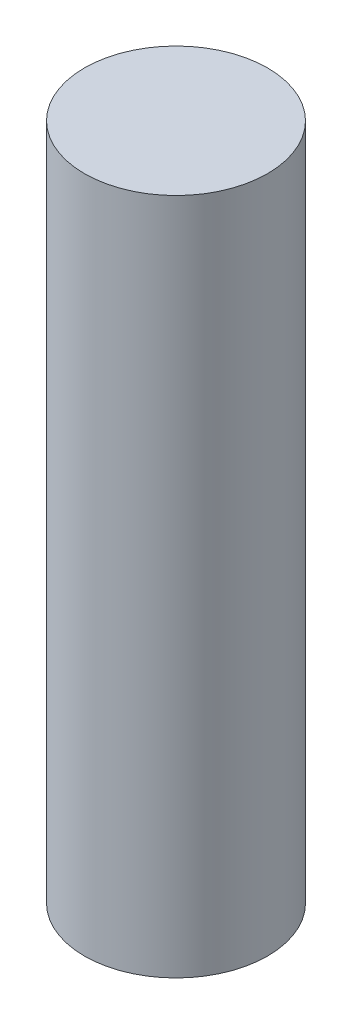
ISO-10303-21;
HEADER;
FILE_DESCRIPTION(('STEP AP214'),'2;1');
FILE_NAME('part.step','',(''),(''),'','','');
FILE_SCHEMA(('AUTOMOTIVE_DESIGN { 1 0 10303 214 1 1 1 1 }'));
ENDSEC;
DATA;
#1=APPLICATION_CONTEXT('core data for automotive mechanical design processes');
#2=APPLICATION_PROTOCOL_DEFINITION('international standard','automotive_design',2000,#1);
#3=PRODUCT_CONTEXT('',#1,'mechanical');
#4=PRODUCT('Part','Part','',(#3));
#5=PRODUCT_RELATED_PRODUCT_CATEGORY('part','',(#4));
#6=PRODUCT_DEFINITION_FORMATION('','',#4);
#7=PRODUCT_DEFINITION_CONTEXT('part definition',#1,'design');
#8=PRODUCT_DEFINITION('design','',#6,#7);
#9=PRODUCT_DEFINITION_SHAPE('','',#8);
#10=(LENGTH_UNIT() NAMED_UNIT(*) SI_UNIT(.MILLI.,.METRE.));
#11=(NAMED_UNIT(*) PLANE_ANGLE_UNIT() SI_UNIT($,.RADIAN.));
#12=(NAMED_UNIT(*) SI_UNIT($,.STERADIAN.) SOLID_ANGLE_UNIT());
#13=UNCERTAINTY_MEASURE_WITH_UNIT(LENGTH_MEASURE(1.E-05),#10,'distance_accuracy_value','');
#14=(GEOMETRIC_REPRESENTATION_CONTEXT(3) GLOBAL_UNCERTAINTY_ASSIGNED_CONTEXT((#13)) GLOBAL_UNIT_ASSIGNED_CONTEXT((#10,
#11,#12)) REPRESENTATION_CONTEXT('',''));
#15=CARTESIAN_POINT('',(0.,0.,0.));
#16=DIRECTION('',(0.,0.,1.));
#17=DIRECTION('',(1.,0.,0.));
#18=AXIS2_PLACEMENT_3D('',#15,#16,#17);
#19=CARTESIAN_POINT('',(0.,93.98,0.));
#20=DIRECTION('',(0.,-1.,0.));
#21=DIRECTION('',(0.,0.,-1.));
#22=AXIS2_PLACEMENT_3D('',#19,#20,#21);
#23=CYLINDRICAL_SURFACE('',#22,12.7);
#24=CARTESIAN_POINT('',(0.,93.98,0.));
#25=DIRECTION('',(0.,1.,0.));
#26=DIRECTION('',(0.,0.,1.));
#27=AXIS2_PLACEMENT_3D('',#24,#25,#26);
#28=CIRCLE('',#27,12.7);
#29=CARTESIAN_POINT('',(0.,93.98,-12.7));
#30=VERTEX_POINT('',#29);
#31=EDGE_CURVE('E10',#30,#30,#28,.T.);
#32=CARTESIAN_POINT('',(0.,0.,0.));
#33=DIRECTION('',(0.,1.,0.));
#34=DIRECTION('',(0.,0.,1.));
#35=AXIS2_PLACEMENT_3D('',#32,#33,#34);
#36=CIRCLE('',#35,12.7);
#37=CARTESIAN_POINT('',(0.,0.,-12.7));
#38=VERTEX_POINT('',#37);
#39=EDGE_CURVE('E38',#38,#38,#36,.T.);
#40=CARTESIAN_POINT('',(0.,93.98,-12.7));
#41=CARTESIAN_POINT('',(0.,93.0010416666667,-12.7));
#42=CARTESIAN_POINT('',(0.,92.0220833333333,-12.7));
#43=CARTESIAN_POINT('',(0.,90.0641666666666,-12.7));
#44=CARTESIAN_POINT('',(0.,89.0852083333333,-12.7));
#45=CARTESIAN_POINT('',(0.,87.1272916666666,-12.7));
#46=CARTESIAN_POINT('',(0.,86.1483333333333,-12.7));
#47=CARTESIAN_POINT('',(0.,84.1904166666666,-12.7));
#48=CARTESIAN_POINT('',(0.,83.2114583333333,-12.7));
#49=CARTESIAN_POINT('',(0.,81.2535416666666,-12.7));
#50=CARTESIAN_POINT('',(0.,80.2745833333333,-12.7));
#51=CARTESIAN_POINT('',(0.,78.3166666666666,-12.7));
#52=CARTESIAN_POINT('',(0.,77.3377083333333,-12.7));
#53=CARTESIAN_POINT('',(0.,75.3797916666666,-12.7));
#54=CARTESIAN_POINT('',(0.,74.4008333333333,-12.7));
#55=CARTESIAN_POINT('',(0.,72.4429166666666,-12.7));
#56=CARTESIAN_POINT('',(0.,71.4639583333333,-12.7));
#57=CARTESIAN_POINT('',(0.,69.5060416666666,-12.7));
#58=CARTESIAN_POINT('',(0.,68.5270833333333,-12.7));
#59=CARTESIAN_POINT('',(0.,66.5691666666666,-12.7));
#60=CARTESIAN_POINT('',(0.,65.5902083333333,-12.7));
#61=CARTESIAN_POINT('',(0.,63.6322916666666,-12.7));
#62=CARTESIAN_POINT('',(0.,62.6533333333333,-12.7));
#63=CARTESIAN_POINT('',(0.,60.6954166666666,-12.7));
#64=CARTESIAN_POINT('',(0.,59.7164583333333,-12.7));
#65=CARTESIAN_POINT('',(0.,57.7585416666666,-12.7));
#66=CARTESIAN_POINT('',(0.,56.7795833333333,-12.7));
#67=CARTESIAN_POINT('',(0.,54.8216666666666,-12.7));
#68=CARTESIAN_POINT('',(0.,53.8427083333333,-12.7));
#69=CARTESIAN_POINT('',(0.,51.8847916666666,-12.7));
#70=CARTESIAN_POINT('',(0.,50.9058333333333,-12.7));
#71=CARTESIAN_POINT('',(0.,48.9479166666666,-12.7));
#72=CARTESIAN_POINT('',(0.,47.9689583333333,-12.7));
#73=CARTESIAN_POINT('',(0.,46.0110416666666,-12.7));
#74=CARTESIAN_POINT('',(0.,45.0320833333333,-12.7));
#75=CARTESIAN_POINT('',(0.,43.0741666666666,-12.7));
#76=CARTESIAN_POINT('',(0.,42.0952083333333,-12.7));
#77=CARTESIAN_POINT('',(0.,40.1372916666666,-12.7));
#78=CARTESIAN_POINT('',(0.,39.1583333333333,-12.7));
#79=CARTESIAN_POINT('',(0.,37.2004166666666,-12.7));
#80=CARTESIAN_POINT('',(0.,36.2214583333333,-12.7));
#81=CARTESIAN_POINT('',(0.,34.2635416666666,-12.7));
#82=CARTESIAN_POINT('',(0.,33.2845833333333,-12.7));
#83=CARTESIAN_POINT('',(0.,31.3266666666667,-12.7));
#84=CARTESIAN_POINT('',(0.,30.3477083333333,-12.7));
#85=CARTESIAN_POINT('',(0.,28.3897916666667,-12.7));
#86=CARTESIAN_POINT('',(0.,27.4108333333333,-12.7));
#87=CARTESIAN_POINT('',(0.,25.4529166666667,-12.7));
#88=CARTESIAN_POINT('',(0.,24.4739583333333,-12.7));
#89=CARTESIAN_POINT('',(0.,22.5160416666667,-12.7));
#90=CARTESIAN_POINT('',(0.,21.5370833333333,-12.7));
#91=CARTESIAN_POINT('',(0.,19.5791666666667,-12.7));
#92=CARTESIAN_POINT('',(0.,18.6002083333333,-12.7));
#93=CARTESIAN_POINT('',(0.,16.6422916666667,-12.7));
#94=CARTESIAN_POINT('',(0.,15.6633333333333,-12.7));
#95=CARTESIAN_POINT('',(0.,13.7054166666667,-12.7));
#96=CARTESIAN_POINT('',(0.,12.7264583333333,-12.7));
#97=CARTESIAN_POINT('',(0.,10.7685416666666,-12.7));
#98=CARTESIAN_POINT('',(0.,9.78958333333332,-12.7));
#99=CARTESIAN_POINT('',(0.,7.83166666666665,-12.7));
#100=CARTESIAN_POINT('',(0.,6.85270833333332,-12.7));
#101=CARTESIAN_POINT('',(0.,4.89479166666665,-12.7));
#102=CARTESIAN_POINT('',(0.,3.91583333333332,-12.7));
#103=CARTESIAN_POINT('',(0.,1.95791666666666,-12.7));
#104=CARTESIAN_POINT('',(0.,0.978958333333321,-12.7));
#105=CARTESIAN_POINT('',(0.,0.,-12.7));
#106=B_SPLINE_CURVE_WITH_KNOTS('',3,(#40,#41,#42,#43,#44,#45,#46,#47,#48,#49,#50,#51,#52,#53,
#54,#55,#56,#57,#58,#59,#60,#61,#62,#63,#64,#65,#66,#67,#68,#69,#70,#71,#72,#73,#74,#75,#76,#77,
#78,#79,#80,#81,#82,#83,#84,#85,#86,#87,#88,#89,#90,#91,#92,#93,#94,#95,#96,#97,#98,#99,#100,
#101,#102,#103,#104,#105),.UNSPECIFIED.,.F.,.F.,(4,2,2,2,2,2,2,2,2,2,2,2,2,2,2,2,2,2,2,2,2,2,2,
2,2,2,2,2,2,2,2,2,4),(0.,2.93687500000001,5.87375000000001,8.810625,11.7475,14.684375,17.62125,
20.558125,23.495,26.431875,29.36875,32.305625,35.2425,38.179375,41.11625,44.053125,46.99,
49.926875,52.86375,55.800625,58.7375,61.674375,64.61125,67.548125,70.485,73.421875,76.35875,
79.295625,82.2325,85.169375,88.10625,91.043125,93.98),.UNSPECIFIED.);
#107=EDGE_CURVE('BSEAM35',#30,#38,#106,.T.);
#108=ORIENTED_EDGE('',*,*,#31,.F.);
#109=ORIENTED_EDGE('',*,*,#39,.T.);
#110=ORIENTED_EDGE('',*,*,#107,.T.);
#111=ORIENTED_EDGE('',*,*,#107,.F.);
#112=EDGE_LOOP('',(#108,#110,#109,#111));
#113=FACE_BOUND('',#112,.T.);
#114=ADVANCED_FACE('F35',(#113),#23,.T.);
#115=CARTESIAN_POINT('',(0.,93.98,0.));
#116=DIRECTION('',(0.,1.,0.));
#117=DIRECTION('',(0.,0.,1.));
#118=AXIS2_PLACEMENT_3D('',#115,#116,#117);
#119=PLANE('',#118);
#120=ORIENTED_EDGE('',*,*,#31,.T.);
#121=EDGE_LOOP('',(#120));
#122=FACE_BOUND('',#121,.T.);
#123=ADVANCED_FACE('F50',(#122),#119,.T.);
#124=CARTESIAN_POINT('',(0.,0.,0.));
#125=DIRECTION('',(0.,1.,0.));
#126=DIRECTION('',(0.,0.,1.));
#127=AXIS2_PLACEMENT_3D('',#124,#125,#126);
#128=PLANE('',#127);
#129=ORIENTED_EDGE('',*,*,#39,.F.);
#130=EDGE_LOOP('',(#129));
#131=FACE_BOUND('',#130,.T.);
#132=ADVANCED_FACE('F48',(#131),#128,.F.);
#133=CLOSED_SHELL('',(#114,#123,#132));
#134=MANIFOLD_SOLID_BREP('B2',#133);
#135=ADVANCED_BREP_SHAPE_REPRESENTATION('',(#18,#134),#14);
#136=SHAPE_DEFINITION_REPRESENTATION(#9,#135);
ENDSEC;
END-ISO-10303-21;
